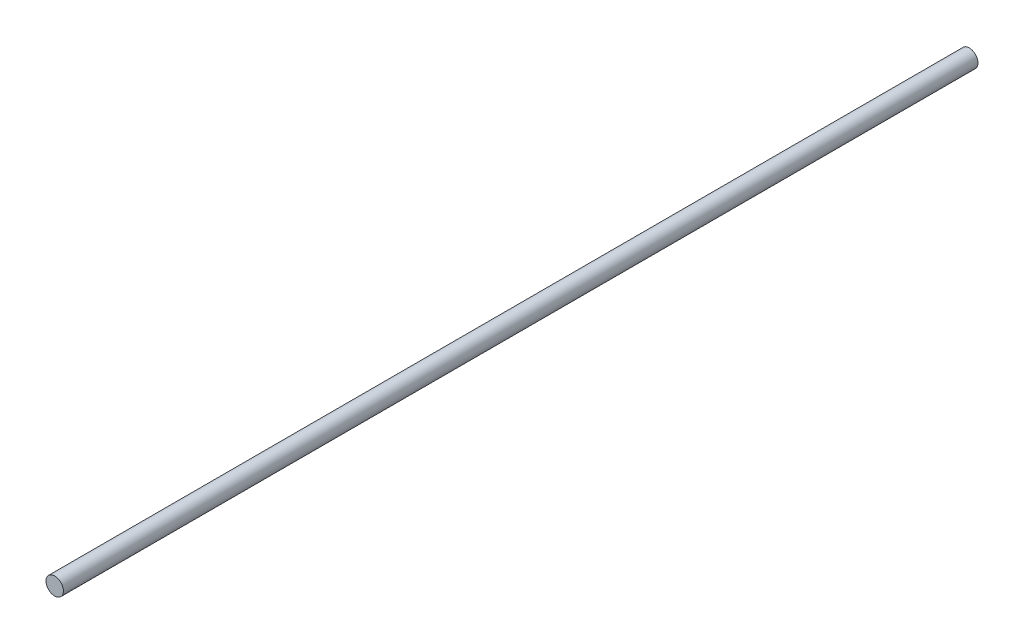
ISO-10303-21;
HEADER;
FILE_DESCRIPTION(('STEP AP214'),'2;1');
FILE_NAME('part.step','',(''),(''),'','','');
FILE_SCHEMA(('AUTOMOTIVE_DESIGN { 1 0 10303 214 1 1 1 1 }'));
ENDSEC;
DATA;
#1=APPLICATION_CONTEXT('core data for automotive mechanical design processes');
#2=APPLICATION_PROTOCOL_DEFINITION('international standard','automotive_design',2000,#1);
#3=PRODUCT_CONTEXT('',#1,'mechanical');
#4=PRODUCT('Part','Part','',(#3));
#5=PRODUCT_RELATED_PRODUCT_CATEGORY('part','',(#4));
#6=PRODUCT_DEFINITION_FORMATION('','',#4);
#7=PRODUCT_DEFINITION_CONTEXT('part definition',#1,'design');
#8=PRODUCT_DEFINITION('design','',#6,#7);
#9=PRODUCT_DEFINITION_SHAPE('','',#8);
#10=(LENGTH_UNIT() NAMED_UNIT(*) SI_UNIT(.MILLI.,.METRE.));
#11=(NAMED_UNIT(*) PLANE_ANGLE_UNIT() SI_UNIT($,.RADIAN.));
#12=(NAMED_UNIT(*) SI_UNIT($,.STERADIAN.) SOLID_ANGLE_UNIT());
#13=UNCERTAINTY_MEASURE_WITH_UNIT(LENGTH_MEASURE(1.E-05),#10,'distance_accuracy_value','');
#14=(GEOMETRIC_REPRESENTATION_CONTEXT(3) GLOBAL_UNCERTAINTY_ASSIGNED_CONTEXT((#13)) GLOBAL_UNIT_ASSIGNED_CONTEXT((#10,
#11,#12)) REPRESENTATION_CONTEXT('',''));
#15=CARTESIAN_POINT('',(0.,0.,0.));
#16=DIRECTION('',(0.,0.,1.));
#17=DIRECTION('',(1.,0.,0.));
#18=AXIS2_PLACEMENT_3D('',#15,#16,#17);
#19=CARTESIAN_POINT('',(-12.3857142857143,7.89285714285715,420.));
#20=DIRECTION('',(0.,0.,-1.));
#21=DIRECTION('',(-1.,0.,0.));
#22=AXIS2_PLACEMENT_3D('',#19,#20,#21);
#23=CYLINDRICAL_SURFACE('',#22,4.);
#24=CARTESIAN_POINT('',(-12.3857142857143,7.89285714285715,420.));
#25=DIRECTION('',(0.,0.,1.));
#26=DIRECTION('',(1.,0.,0.));
#27=AXIS2_PLACEMENT_3D('',#24,#25,#26);
#28=CIRCLE('',#27,4.);
#29=CARTESIAN_POINT('',(-8.38571428571431,7.89285714285715,420.));
#30=VERTEX_POINT('',#29);
#31=EDGE_CURVE('E10',#30,#30,#28,.T.);
#32=ORIENTED_EDGE('',*,*,#31,.F.);
#33=EDGE_LOOP('',(#32));
#34=FACE_BOUND('',#33,.T.);
#35=CARTESIAN_POINT('',(-12.3857142857143,7.89285714285715,0.));
#36=DIRECTION('',(0.,0.,1.));
#37=DIRECTION('',(1.,0.,0.));
#38=AXIS2_PLACEMENT_3D('',#35,#36,#37);
#39=CIRCLE('',#38,4.);
#40=CARTESIAN_POINT('',(-8.38571428571431,7.89285714285715,0.));
#41=VERTEX_POINT('',#40);
#42=EDGE_CURVE('E34',#41,#41,#39,.T.);
#43=ORIENTED_EDGE('',*,*,#42,.T.);
#44=EDGE_LOOP('',(#43));
#45=FACE_BOUND('',#44,.T.);
#46=ADVANCED_FACE('F31',(#34,#45),#23,.T.);
#47=CARTESIAN_POINT('',(-12.3857142857143,7.89285714285715,420.));
#48=DIRECTION('',(0.,0.,1.));
#49=DIRECTION('',(1.,0.,0.));
#50=AXIS2_PLACEMENT_3D('',#47,#48,#49);
#51=PLANE('',#50);
#52=ORIENTED_EDGE('',*,*,#31,.T.);
#53=EDGE_LOOP('',(#52));
#54=FACE_BOUND('',#53,.T.);
#55=ADVANCED_FACE('F46',(#54),#51,.T.);
#56=CARTESIAN_POINT('',(-12.3857142857143,7.89285714285715,0.));
#57=DIRECTION('',(0.,0.,1.));
#58=DIRECTION('',(1.,0.,0.));
#59=AXIS2_PLACEMENT_3D('',#56,#57,#58);
#60=PLANE('',#59);
#61=ORIENTED_EDGE('',*,*,#42,.F.);
#62=EDGE_LOOP('',(#61));
#63=FACE_BOUND('',#62,.T.);
#64=ADVANCED_FACE('F44',(#63),#60,.F.);
#65=CLOSED_SHELL('',(#46,#55,#64));
#66=MANIFOLD_SOLID_BREP('B2',#65);
#67=ADVANCED_BREP_SHAPE_REPRESENTATION('',(#18,#66),#14);
#68=SHAPE_DEFINITION_REPRESENTATION(#9,#67);
ENDSEC;
END-ISO-10303-21;
